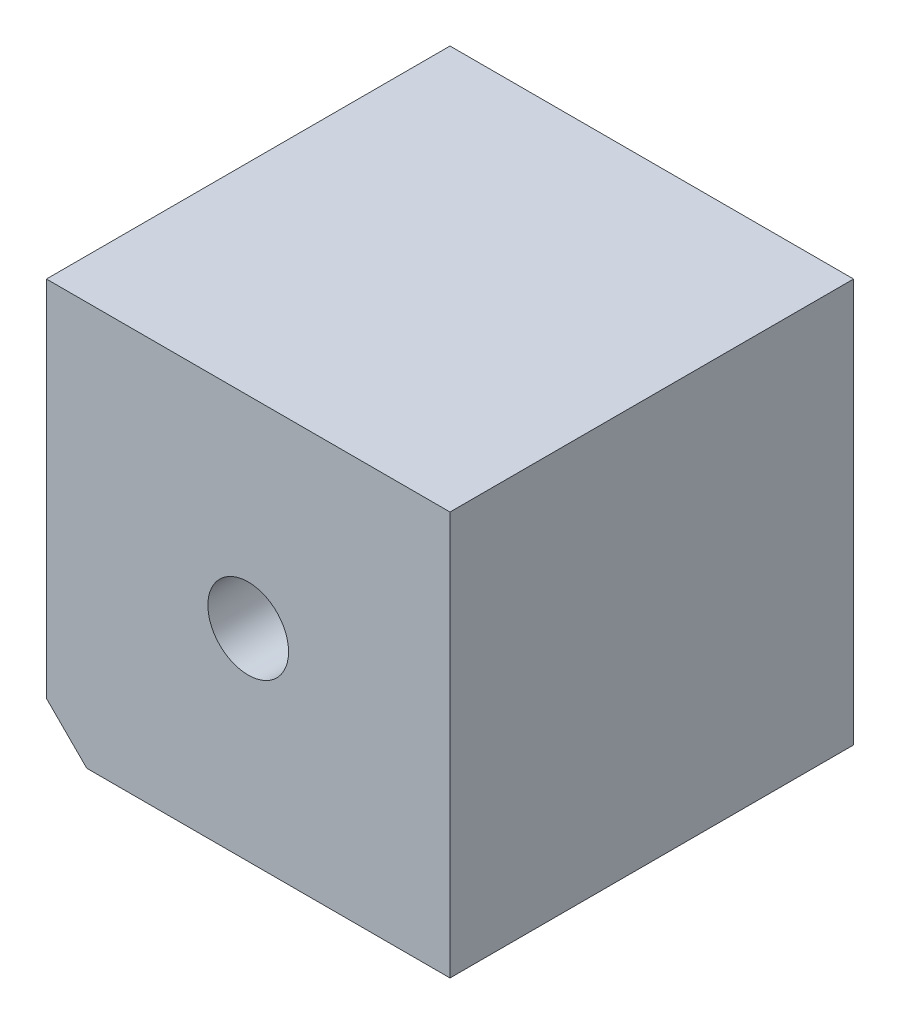
ISO-10303-21;
HEADER;
FILE_DESCRIPTION(('STEP AP214'),'2;1');
FILE_NAME('part.step','',(''),(''),'','','');
FILE_SCHEMA(('AUTOMOTIVE_DESIGN { 1 0 10303 214 1 1 1 1 }'));
ENDSEC;
DATA;
#1=APPLICATION_CONTEXT('core data for automotive mechanical design processes');
#2=APPLICATION_PROTOCOL_DEFINITION('international standard','automotive_design',2000,#1);
#3=PRODUCT_CONTEXT('',#1,'mechanical');
#4=PRODUCT('Part','Part','',(#3));
#5=PRODUCT_RELATED_PRODUCT_CATEGORY('part','',(#4));
#6=PRODUCT_DEFINITION_FORMATION('','',#4);
#7=PRODUCT_DEFINITION_CONTEXT('part definition',#1,'design');
#8=PRODUCT_DEFINITION('design','',#6,#7);
#9=PRODUCT_DEFINITION_SHAPE('','',#8);
#10=(LENGTH_UNIT() NAMED_UNIT(*) SI_UNIT(.MILLI.,.METRE.));
#11=(NAMED_UNIT(*) PLANE_ANGLE_UNIT() SI_UNIT($,.RADIAN.));
#12=(NAMED_UNIT(*) SI_UNIT($,.STERADIAN.) SOLID_ANGLE_UNIT());
#13=UNCERTAINTY_MEASURE_WITH_UNIT(LENGTH_MEASURE(1.E-05),#10,'distance_accuracy_value','');
#14=(GEOMETRIC_REPRESENTATION_CONTEXT(3) GLOBAL_UNCERTAINTY_ASSIGNED_CONTEXT((#13)) GLOBAL_UNIT_ASSIGNED_CONTEXT((#10,
#11,#12)) REPRESENTATION_CONTEXT('',''));
#15=CARTESIAN_POINT('',(0.,0.,0.));
#16=DIRECTION('',(0.,0.,1.));
#17=DIRECTION('',(1.,0.,0.));
#18=AXIS2_PLACEMENT_3D('',#15,#16,#17);
#19=CARTESIAN_POINT('',(50.,50.,100.));
#20=DIRECTION('',(-1.,0.,0.));
#21=DIRECTION('',(0.,-1.,0.));
#22=AXIS2_PLACEMENT_3D('',#19,#20,#21);
#23=PLANE('',#22);
#24=DIRECTION('',(0.,1.,0.));
#25=VECTOR('',#24,1.);
#26=CARTESIAN_POINT('',(50.,50.,0.));
#27=LINE('',#26,#25);
#28=CARTESIAN_POINT('',(50.,-50.,0.));
#29=VERTEX_POINT('',#28);
#30=CARTESIAN_POINT('',(50.,50.,0.));
#31=VERTEX_POINT('',#30);
#32=EDGE_CURVE('E105',#29,#31,#27,.T.);
#33=ORIENTED_EDGE('',*,*,#32,.T.);
#34=DIRECTION('',(0.,0.,-1.));
#35=VECTOR('',#34,1.);
#36=CARTESIAN_POINT('',(50.,50.,100.));
#37=LINE('',#36,#35);
#38=CARTESIAN_POINT('',(50.,50.,100.));
#39=VERTEX_POINT('',#38);
#40=EDGE_CURVE('E87',#39,#31,#37,.T.);
#41=ORIENTED_EDGE('',*,*,#40,.F.);
#42=DIRECTION('',(0.,1.,0.));
#43=VECTOR('',#42,1.);
#44=CARTESIAN_POINT('',(50.,50.,100.));
#45=LINE('',#44,#43);
#46=CARTESIAN_POINT('',(50.,-50.,100.));
#47=VERTEX_POINT('',#46);
#48=EDGE_CURVE('E93',#47,#39,#45,.T.);
#49=ORIENTED_EDGE('',*,*,#48,.F.);
#50=DIRECTION('',(0.,0.,-1.));
#51=VECTOR('',#50,1.);
#52=CARTESIAN_POINT('',(50.,-50.,100.));
#53=LINE('',#52,#51);
#54=EDGE_CURVE('E110',#47,#29,#53,.T.);
#55=ORIENTED_EDGE('',*,*,#54,.T.);
#56=EDGE_LOOP('',(#33,#41,#49,#55));
#57=FACE_BOUND('',#56,.T.);
#58=ADVANCED_FACE('F35',(#57),#23,.F.);
#59=CARTESIAN_POINT('',(-50.,50.,100.));
#60=DIRECTION('',(0.,-1.,0.));
#61=DIRECTION('',(0.,0.,-1.));
#62=AXIS2_PLACEMENT_3D('',#59,#60,#61);
#63=PLANE('',#62);
#64=DIRECTION('',(-1.,0.,0.));
#65=VECTOR('',#64,1.);
#66=CARTESIAN_POINT('',(-50.,50.,0.));
#67=LINE('',#66,#65);
#68=CARTESIAN_POINT('',(-50.,50.,0.));
#69=VERTEX_POINT('',#68);
#70=EDGE_CURVE('E118',#31,#69,#67,.T.);
#71=ORIENTED_EDGE('',*,*,#70,.T.);
#72=DIRECTION('',(0.,0.,-1.));
#73=VECTOR('',#72,1.);
#74=CARTESIAN_POINT('',(-50.,50.,100.));
#75=LINE('',#74,#73);
#76=CARTESIAN_POINT('',(-50.,50.,100.));
#77=VERTEX_POINT('',#76);
#78=EDGE_CURVE('E90',#77,#69,#75,.T.);
#79=ORIENTED_EDGE('',*,*,#78,.F.);
#80=DIRECTION('',(-1.,0.,0.));
#81=VECTOR('',#80,1.);
#82=CARTESIAN_POINT('',(-50.,50.,100.));
#83=LINE('',#82,#81);
#84=EDGE_CURVE('E83',#39,#77,#83,.T.);
#85=ORIENTED_EDGE('',*,*,#84,.F.);
#86=ORIENTED_EDGE('',*,*,#40,.T.);
#87=EDGE_LOOP('',(#71,#79,#85,#86));
#88=FACE_BOUND('',#87,.T.);
#89=ADVANCED_FACE('F85',(#88),#63,.F.);
#90=CARTESIAN_POINT('',(-50.,50.,100.));
#91=DIRECTION('',(1.,0.,0.));
#92=DIRECTION('',(0.,1.,0.));
#93=AXIS2_PLACEMENT_3D('',#90,#91,#92);
#94=PLANE('',#93);
#95=DIRECTION('',(0.,-1.,0.));
#96=VECTOR('',#95,1.);
#97=CARTESIAN_POINT('',(-50.,50.,0.));
#98=LINE('',#97,#96);
#99=CARTESIAN_POINT('',(-50.,-39.9999999999999,0.));
#100=VERTEX_POINT('',#99);
#101=EDGE_CURVE('E116',#69,#100,#98,.T.);
#102=ORIENTED_EDGE('',*,*,#101,.T.);
#103=DIRECTION('',(0.,0.,1.));
#104=VECTOR('',#103,1.);
#105=CARTESIAN_POINT('',(-50.,-39.9999999999999,100.));
#106=LINE('',#105,#104);
#107=CARTESIAN_POINT('',(-50.,-39.9999999999999,100.));
#108=VERTEX_POINT('',#107);
#109=EDGE_CURVE('E44',#100,#108,#106,.T.);
#110=ORIENTED_EDGE('',*,*,#109,.T.);
#111=DIRECTION('',(0.,-1.,0.));
#112=VECTOR('',#111,1.);
#113=CARTESIAN_POINT('',(-50.,50.,100.));
#114=LINE('',#113,#112);
#115=EDGE_CURVE('E92',#77,#108,#114,.T.);
#116=ORIENTED_EDGE('',*,*,#115,.F.);
#117=ORIENTED_EDGE('',*,*,#78,.T.);
#118=EDGE_LOOP('',(#102,#110,#116,#117));
#119=FACE_BOUND('',#118,.T.);
#120=ADVANCED_FACE('F147',(#119),#94,.F.);
#121=CARTESIAN_POINT('',(-50.,-50.,100.));
#122=DIRECTION('',(0.,1.,0.));
#123=DIRECTION('',(0.,0.,1.));
#124=AXIS2_PLACEMENT_3D('',#121,#122,#123);
#125=PLANE('',#124);
#126=DIRECTION('',(1.,0.,0.));
#127=VECTOR('',#126,1.);
#128=CARTESIAN_POINT('',(-50.,-50.,100.));
#129=LINE('',#128,#127);
#130=CARTESIAN_POINT('',(-40.,-50.,100.));
#131=VERTEX_POINT('',#130);
#132=EDGE_CURVE('E98',#131,#47,#129,.T.);
#133=ORIENTED_EDGE('',*,*,#132,.F.);
#134=DIRECTION('',(0.,0.,-1.));
#135=VECTOR('',#134,1.);
#136=CARTESIAN_POINT('',(-40.,-50.,100.));
#137=LINE('',#136,#135);
#138=CARTESIAN_POINT('',(-40.,-50.,0.));
#139=VERTEX_POINT('',#138);
#140=EDGE_CURVE('E106',#131,#139,#137,.T.);
#141=ORIENTED_EDGE('',*,*,#140,.T.);
#142=DIRECTION('',(1.,0.,0.));
#143=VECTOR('',#142,1.);
#144=CARTESIAN_POINT('',(-50.,-50.,0.));
#145=LINE('',#144,#143);
#146=EDGE_CURVE('E102',#139,#29,#145,.T.);
#147=ORIENTED_EDGE('',*,*,#146,.T.);
#148=ORIENTED_EDGE('',*,*,#54,.F.);
#149=EDGE_LOOP('',(#133,#141,#147,#148));
#150=FACE_BOUND('',#149,.T.);
#151=ADVANCED_FACE('F140',(#150),#125,.F.);
#152=CARTESIAN_POINT('',(0.,0.,100.));
#153=DIRECTION('',(0.,0.,1.));
#154=DIRECTION('',(1.,0.,0.));
#155=AXIS2_PLACEMENT_3D('',#152,#153,#154);
#156=PLANE('',#155);
#157=CARTESIAN_POINT('',(0.,0.,100.));
#158=DIRECTION('',(0.,0.,1.));
#159=DIRECTION('',(1.,0.,0.));
#160=AXIS2_PLACEMENT_3D('',#157,#158,#159);
#161=CIRCLE('',#160,10.);
#162=CARTESIAN_POINT('',(10.,0.,100.));
#163=VERTEX_POINT('',#162);
#164=EDGE_CURVE('E124',#163,#163,#161,.T.);
#165=ORIENTED_EDGE('',*,*,#164,.F.);
#166=EDGE_LOOP('',(#165));
#167=FACE_BOUND('',#166,.T.);
#168=ORIENTED_EDGE('',*,*,#115,.T.);
#169=DIRECTION('',(-0.707106781186547,0.707106781186548,0.));
#170=VECTOR('',#169,1.);
#171=CARTESIAN_POINT('',(-45.,-44.9999999999999,100.));
#172=LINE('',#171,#170);
#173=EDGE_CURVE('E11',#108,#131,#172,.F.);
#174=ORIENTED_EDGE('',*,*,#173,.T.);
#175=ORIENTED_EDGE('',*,*,#132,.T.);
#176=ORIENTED_EDGE('',*,*,#48,.T.);
#177=ORIENTED_EDGE('',*,*,#84,.T.);
#178=EDGE_LOOP('',(#168,#174,#175,#176,#177));
#179=FACE_BOUND('',#178,.T.);
#180=ADVANCED_FACE('F96',(#167,#179),#156,.T.);
#181=CARTESIAN_POINT('',(0.,0.,0.));
#182=DIRECTION('',(0.,0.,1.));
#183=DIRECTION('',(1.,0.,0.));
#184=AXIS2_PLACEMENT_3D('',#181,#182,#183);
#185=PLANE('',#184);
#186=ORIENTED_EDGE('',*,*,#146,.F.);
#187=DIRECTION('',(0.707106781186547,-0.707106781186548,0.));
#188=VECTOR('',#187,1.);
#189=CARTESIAN_POINT('',(-40.,-50.,0.));
#190=LINE('',#189,#188);
#191=EDGE_CURVE('E58',#139,#100,#190,.F.);
#192=ORIENTED_EDGE('',*,*,#191,.T.);
#193=ORIENTED_EDGE('',*,*,#101,.F.);
#194=ORIENTED_EDGE('',*,*,#70,.F.);
#195=ORIENTED_EDGE('',*,*,#32,.F.);
#196=EDGE_LOOP('',(#186,#192,#193,#194,#195));
#197=FACE_BOUND('',#196,.T.);
#198=ADVANCED_FACE('F135',(#197),#185,.F.);
#199=CARTESIAN_POINT('',(0.,0.,42.));
#200=DIRECTION('',(0.,0.,1.));
#201=DIRECTION('',(1.,0.,0.));
#202=AXIS2_PLACEMENT_3D('',#199,#200,#201);
#203=CYLINDRICAL_SURFACE('',#202,10.);
#204=CARTESIAN_POINT('',(0.,0.,42.));
#205=DIRECTION('',(0.,0.,1.));
#206=DIRECTION('',(1.,0.,0.));
#207=AXIS2_PLACEMENT_3D('',#204,#205,#206);
#208=CIRCLE('',#207,10.);
#209=CARTESIAN_POINT('',(10.,0.,42.));
#210=VERTEX_POINT('',#209);
#211=EDGE_CURVE('E121',#210,#210,#208,.T.);
#212=ORIENTED_EDGE('',*,*,#211,.F.);
#213=EDGE_LOOP('',(#212));
#214=FACE_BOUND('',#213,.T.);
#215=ORIENTED_EDGE('',*,*,#164,.T.);
#216=EDGE_LOOP('',(#215));
#217=FACE_BOUND('',#216,.T.);
#218=ADVANCED_FACE('F132',(#214,#217),#203,.F.);
#219=CARTESIAN_POINT('',(0.,0.,42.));
#220=DIRECTION('',(0.,0.,1.));
#221=DIRECTION('',(1.,0.,0.));
#222=AXIS2_PLACEMENT_3D('',#219,#220,#221);
#223=PLANE('',#222);
#224=ORIENTED_EDGE('',*,*,#211,.T.);
#225=EDGE_LOOP('',(#224));
#226=FACE_BOUND('',#225,.T.);
#227=ADVANCED_FACE('F130',(#226),#223,.T.);
#228=CARTESIAN_POINT('',(-40.,-50.,100.));
#229=DIRECTION('',(0.707106781186548,0.707106781186547,0.));
#230=DIRECTION('',(0.,0.,-1.));
#231=AXIS2_PLACEMENT_3D('',#228,#229,#230);
#232=PLANE('',#231);
#233=ORIENTED_EDGE('',*,*,#173,.F.);
#234=ORIENTED_EDGE('',*,*,#109,.F.);
#235=ORIENTED_EDGE('',*,*,#191,.F.);
#236=ORIENTED_EDGE('',*,*,#140,.F.);
#237=EDGE_LOOP('',(#233,#234,#235,#236));
#238=FACE_BOUND('',#237,.T.);
#239=ADVANCED_FACE('F38',(#238),#232,.F.);
#240=CLOSED_SHELL('',(#58,#89,#120,#151,#180,#198,#218,#227,#239));
#241=MANIFOLD_SOLID_BREP('B2',#240);
#242=ADVANCED_BREP_SHAPE_REPRESENTATION('',(#18,#241),#14);
#243=SHAPE_DEFINITION_REPRESENTATION(#9,#242);
ENDSEC;
END-ISO-10303-21;
